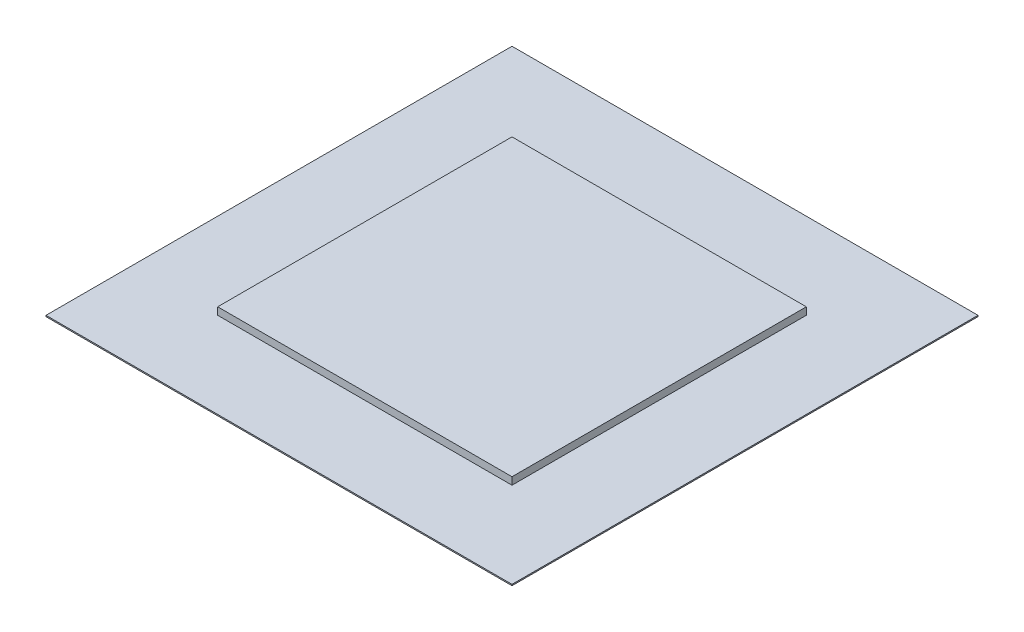
ISO-10303-21;
HEADER;
FILE_DESCRIPTION(('STEP AP214'),'2;1');
FILE_NAME('part.step','',(''),(''),'','','');
FILE_SCHEMA(('AUTOMOTIVE_DESIGN { 1 0 10303 214 1 1 1 1 }'));
ENDSEC;
DATA;
#1=APPLICATION_CONTEXT('core data for automotive mechanical design processes');
#2=APPLICATION_PROTOCOL_DEFINITION('international standard','automotive_design',2000,#1);
#3=PRODUCT_CONTEXT('',#1,'mechanical');
#4=PRODUCT('Part','Part','',(#3));
#5=PRODUCT_RELATED_PRODUCT_CATEGORY('part','',(#4));
#6=PRODUCT_DEFINITION_FORMATION('','',#4);
#7=PRODUCT_DEFINITION_CONTEXT('part definition',#1,'design');
#8=PRODUCT_DEFINITION('design','',#6,#7);
#9=PRODUCT_DEFINITION_SHAPE('','',#8);
#10=(LENGTH_UNIT() NAMED_UNIT(*) SI_UNIT(.MILLI.,.METRE.));
#11=(NAMED_UNIT(*) PLANE_ANGLE_UNIT() SI_UNIT($,.RADIAN.));
#12=(NAMED_UNIT(*) SI_UNIT($,.STERADIAN.) SOLID_ANGLE_UNIT());
#13=UNCERTAINTY_MEASURE_WITH_UNIT(LENGTH_MEASURE(1.E-05),#10,'distance_accuracy_value','');
#14=(GEOMETRIC_REPRESENTATION_CONTEXT(3) GLOBAL_UNCERTAINTY_ASSIGNED_CONTEXT((#13)) GLOBAL_UNIT_ASSIGNED_CONTEXT((#10,
#11,#12)) REPRESENTATION_CONTEXT('',''));
#15=CARTESIAN_POINT('',(0.,0.,0.));
#16=DIRECTION('',(0.,0.,1.));
#17=DIRECTION('',(1.,0.,0.));
#18=AXIS2_PLACEMENT_3D('',#15,#16,#17);
#19=CARTESIAN_POINT('',(1200.,60.,-1200.));
#20=DIRECTION('',(-1.,0.,0.));
#21=DIRECTION('',(0.,0.,1.));
#22=AXIS2_PLACEMENT_3D('',#19,#20,#21);
#23=PLANE('',#22);
#24=DIRECTION('',(0.,0.,-1.));
#25=VECTOR('',#24,1.);
#26=CARTESIAN_POINT('',(1200.,0.,-1200.));
#27=LINE('',#26,#25);
#28=CARTESIAN_POINT('',(1200.,0.,1200.));
#29=VERTEX_POINT('',#28);
#30=CARTESIAN_POINT('',(1200.,0.,-1200.));
#31=VERTEX_POINT('',#30);
#32=EDGE_CURVE('E120',#29,#31,#27,.T.);
#33=ORIENTED_EDGE('',*,*,#32,.T.);
#34=DIRECTION('',(0.,-1.,0.));
#35=VECTOR('',#34,1.);
#36=CARTESIAN_POINT('',(1200.,60.,-1200.));
#37=LINE('',#36,#35);
#38=CARTESIAN_POINT('',(1200.,60.,-1200.));
#39=VERTEX_POINT('',#38);
#40=EDGE_CURVE('E11',#39,#31,#37,.T.);
#41=ORIENTED_EDGE('',*,*,#40,.F.);
#42=DIRECTION('',(0.,0.,-1.));
#43=VECTOR('',#42,1.);
#44=CARTESIAN_POINT('',(1200.,60.,-1200.));
#45=LINE('',#44,#43);
#46=CARTESIAN_POINT('',(1200.,60.,1200.));
#47=VERTEX_POINT('',#46);
#48=EDGE_CURVE('E129',#47,#39,#45,.T.);
#49=ORIENTED_EDGE('',*,*,#48,.F.);
#50=DIRECTION('',(0.,-1.,0.));
#51=VECTOR('',#50,1.);
#52=CARTESIAN_POINT('',(1200.,60.,1200.));
#53=LINE('',#52,#51);
#54=EDGE_CURVE('E136',#47,#29,#53,.T.);
#55=ORIENTED_EDGE('',*,*,#54,.T.);
#56=EDGE_LOOP('',(#33,#41,#49,#55));
#57=FACE_BOUND('',#56,.T.);
#58=ADVANCED_FACE('F35',(#57),#23,.F.);
#59=CARTESIAN_POINT('',(-1200.,60.,-1200.));
#60=DIRECTION('',(0.,0.,1.));
#61=DIRECTION('',(1.,0.,0.));
#62=AXIS2_PLACEMENT_3D('',#59,#60,#61);
#63=PLANE('',#62);
#64=DIRECTION('',(-1.,0.,0.));
#65=VECTOR('',#64,1.);
#66=CARTESIAN_POINT('',(-1200.,0.,-1200.));
#67=LINE('',#66,#65);
#68=CARTESIAN_POINT('',(-1200.,0.,-1200.));
#69=VERTEX_POINT('',#68);
#70=EDGE_CURVE('E123',#31,#69,#67,.T.);
#71=ORIENTED_EDGE('',*,*,#70,.T.);
#72=DIRECTION('',(0.,-1.,0.));
#73=VECTOR('',#72,1.);
#74=CARTESIAN_POINT('',(-1200.,60.,-1200.));
#75=LINE('',#74,#73);
#76=CARTESIAN_POINT('',(-1200.,60.,-1200.));
#77=VERTEX_POINT('',#76);
#78=EDGE_CURVE('E43',#77,#69,#75,.T.);
#79=ORIENTED_EDGE('',*,*,#78,.F.);
#80=DIRECTION('',(-1.,0.,0.));
#81=VECTOR('',#80,1.);
#82=CARTESIAN_POINT('',(-1200.,60.,-1200.));
#83=LINE('',#82,#81);
#84=EDGE_CURVE('E131',#39,#77,#83,.T.);
#85=ORIENTED_EDGE('',*,*,#84,.F.);
#86=ORIENTED_EDGE('',*,*,#40,.T.);
#87=EDGE_LOOP('',(#71,#79,#85,#86));
#88=FACE_BOUND('',#87,.T.);
#89=ADVANCED_FACE('F157',(#88),#63,.F.);
#90=CARTESIAN_POINT('',(-1200.,60.,-1200.));
#91=DIRECTION('',(1.,0.,0.));
#92=DIRECTION('',(0.,0.,-1.));
#93=AXIS2_PLACEMENT_3D('',#90,#91,#92);
#94=PLANE('',#93);
#95=DIRECTION('',(0.,0.,1.));
#96=VECTOR('',#95,1.);
#97=CARTESIAN_POINT('',(-1200.,0.,-1200.));
#98=LINE('',#97,#96);
#99=CARTESIAN_POINT('',(-1200.,0.,1200.));
#100=VERTEX_POINT('',#99);
#101=EDGE_CURVE('E140',#69,#100,#98,.T.);
#102=ORIENTED_EDGE('',*,*,#101,.T.);
#103=DIRECTION('',(0.,-1.,0.));
#104=VECTOR('',#103,1.);
#105=CARTESIAN_POINT('',(-1200.,60.,1200.));
#106=LINE('',#105,#104);
#107=CARTESIAN_POINT('',(-1200.,60.,1200.));
#108=VERTEX_POINT('',#107);
#109=EDGE_CURVE('E147',#108,#100,#106,.T.);
#110=ORIENTED_EDGE('',*,*,#109,.F.);
#111=DIRECTION('',(0.,0.,1.));
#112=VECTOR('',#111,1.);
#113=CARTESIAN_POINT('',(-1200.,60.,-1200.));
#114=LINE('',#113,#112);
#115=EDGE_CURVE('E134',#77,#108,#114,.T.);
#116=ORIENTED_EDGE('',*,*,#115,.F.);
#117=ORIENTED_EDGE('',*,*,#78,.T.);
#118=EDGE_LOOP('',(#102,#110,#116,#117));
#119=FACE_BOUND('',#118,.T.);
#120=ADVANCED_FACE('F153',(#119),#94,.F.);
#121=CARTESIAN_POINT('',(-1200.,60.,1200.));
#122=DIRECTION('',(0.,0.,-1.));
#123=DIRECTION('',(-1.,0.,0.));
#124=AXIS2_PLACEMENT_3D('',#121,#122,#123);
#125=PLANE('',#124);
#126=DIRECTION('',(1.,0.,0.));
#127=VECTOR('',#126,1.);
#128=CARTESIAN_POINT('',(-1200.,0.,1200.));
#129=LINE('',#128,#127);
#130=EDGE_CURVE('E132',#100,#29,#129,.T.);
#131=ORIENTED_EDGE('',*,*,#130,.T.);
#132=ORIENTED_EDGE('',*,*,#54,.F.);
#133=DIRECTION('',(1.,0.,0.));
#134=VECTOR('',#133,1.);
#135=CARTESIAN_POINT('',(-1200.,60.,1200.));
#136=LINE('',#135,#134);
#137=EDGE_CURVE('E50',#108,#47,#136,.T.);
#138=ORIENTED_EDGE('',*,*,#137,.F.);
#139=ORIENTED_EDGE('',*,*,#109,.T.);
#140=EDGE_LOOP('',(#131,#132,#138,#139));
#141=FACE_BOUND('',#140,.T.);
#142=ADVANCED_FACE('F163',(#141),#125,.F.);
#143=CARTESIAN_POINT('',(0.,60.,0.));
#144=DIRECTION('',(0.,1.,0.));
#145=DIRECTION('',(0.,0.,1.));
#146=AXIS2_PLACEMENT_3D('',#143,#144,#145);
#147=PLANE('',#146);
#148=ORIENTED_EDGE('',*,*,#48,.T.);
#149=ORIENTED_EDGE('',*,*,#84,.T.);
#150=ORIENTED_EDGE('',*,*,#115,.T.);
#151=ORIENTED_EDGE('',*,*,#137,.T.);
#152=EDGE_LOOP('',(#148,#149,#150,#151));
#153=FACE_BOUND('',#152,.T.);
#154=ADVANCED_FACE('F166',(#153),#147,.T.);
#155=CARTESIAN_POINT('',(-1900.,-10.,-1900.));
#156=DIRECTION('',(0.,0.,1.));
#157=DIRECTION('',(1.,0.,0.));
#158=AXIS2_PLACEMENT_3D('',#155,#156,#157);
#159=PLANE('',#158);
#160=DIRECTION('',(1.,0.,0.));
#161=VECTOR('',#160,1.);
#162=CARTESIAN_POINT('',(-1900.,0.,-1900.));
#163=LINE('',#162,#161);
#164=CARTESIAN_POINT('',(-1900.,0.,-1900.));
#165=VERTEX_POINT('',#164);
#166=CARTESIAN_POINT('',(1900.,0.,-1900.));
#167=VERTEX_POINT('',#166);
#168=EDGE_CURVE('E119',#165,#167,#163,.T.);
#169=ORIENTED_EDGE('',*,*,#168,.T.);
#170=DIRECTION('',(0.,1.,0.));
#171=VECTOR('',#170,1.);
#172=CARTESIAN_POINT('',(1900.,-10.,-1900.));
#173=LINE('',#172,#171);
#174=CARTESIAN_POINT('',(1900.,-10.,-1900.));
#175=VERTEX_POINT('',#174);
#176=EDGE_CURVE('E99',#175,#167,#173,.T.);
#177=ORIENTED_EDGE('',*,*,#176,.F.);
#178=DIRECTION('',(1.,0.,0.));
#179=VECTOR('',#178,1.);
#180=CARTESIAN_POINT('',(-1900.,-10.,-1900.));
#181=LINE('',#180,#179);
#182=CARTESIAN_POINT('',(-1900.,-10.,-1900.));
#183=VERTEX_POINT('',#182);
#184=EDGE_CURVE('E106',#183,#175,#181,.T.);
#185=ORIENTED_EDGE('',*,*,#184,.F.);
#186=DIRECTION('',(0.,1.,0.));
#187=VECTOR('',#186,1.);
#188=CARTESIAN_POINT('',(-1900.,-10.,-1900.));
#189=LINE('',#188,#187);
#190=EDGE_CURVE('E246',#183,#165,#189,.T.);
#191=ORIENTED_EDGE('',*,*,#190,.T.);
#192=EDGE_LOOP('',(#169,#177,#185,#191));
#193=FACE_BOUND('',#192,.T.);
#194=ADVANCED_FACE('F117',(#193),#159,.F.);
#195=CARTESIAN_POINT('',(1900.,-10.,-1900.));
#196=DIRECTION('',(-1.,0.,0.));
#197=DIRECTION('',(0.,0.,1.));
#198=AXIS2_PLACEMENT_3D('',#195,#196,#197);
#199=PLANE('',#198);
#200=DIRECTION('',(0.,0.,1.));
#201=VECTOR('',#200,1.);
#202=CARTESIAN_POINT('',(1900.,0.,-1900.));
#203=LINE('',#202,#201);
#204=CARTESIAN_POINT('',(1900.,0.,1900.));
#205=VERTEX_POINT('',#204);
#206=EDGE_CURVE('E252',#167,#205,#203,.T.);
#207=ORIENTED_EDGE('',*,*,#206,.T.);
#208=DIRECTION('',(0.,1.,0.));
#209=VECTOR('',#208,1.);
#210=CARTESIAN_POINT('',(1900.,-10.,1900.));
#211=LINE('',#210,#209);
#212=CARTESIAN_POINT('',(1900.,-10.,1900.));
#213=VERTEX_POINT('',#212);
#214=EDGE_CURVE('E102',#213,#205,#211,.T.);
#215=ORIENTED_EDGE('',*,*,#214,.F.);
#216=DIRECTION('',(0.,0.,1.));
#217=VECTOR('',#216,1.);
#218=CARTESIAN_POINT('',(1900.,-10.,-1900.));
#219=LINE('',#218,#217);
#220=EDGE_CURVE('E95',#175,#213,#219,.T.);
#221=ORIENTED_EDGE('',*,*,#220,.F.);
#222=ORIENTED_EDGE('',*,*,#176,.T.);
#223=EDGE_LOOP('',(#207,#215,#221,#222));
#224=FACE_BOUND('',#223,.T.);
#225=ADVANCED_FACE('F97',(#224),#199,.F.);
#226=CARTESIAN_POINT('',(1900.,-10.,1900.));
#227=DIRECTION('',(0.,0.,-1.));
#228=DIRECTION('',(-1.,0.,0.));
#229=AXIS2_PLACEMENT_3D('',#226,#227,#228);
#230=PLANE('',#229);
#231=DIRECTION('',(-1.,0.,0.));
#232=VECTOR('',#231,1.);
#233=CARTESIAN_POINT('',(1900.,0.,1900.));
#234=LINE('',#233,#232);
#235=CARTESIAN_POINT('',(-1900.,0.,1900.));
#236=VERTEX_POINT('',#235);
#237=EDGE_CURVE('E249',#205,#236,#234,.T.);
#238=ORIENTED_EDGE('',*,*,#237,.T.);
#239=DIRECTION('',(0.,1.,0.));
#240=VECTOR('',#239,1.);
#241=CARTESIAN_POINT('',(-1900.,-10.,1900.));
#242=LINE('',#241,#240);
#243=CARTESIAN_POINT('',(-1900.,-10.,1900.));
#244=VERTEX_POINT('',#243);
#245=EDGE_CURVE('E125',#244,#236,#242,.T.);
#246=ORIENTED_EDGE('',*,*,#245,.F.);
#247=DIRECTION('',(-1.,0.,0.));
#248=VECTOR('',#247,1.);
#249=CARTESIAN_POINT('',(1900.,-10.,1900.));
#250=LINE('',#249,#248);
#251=EDGE_CURVE('E105',#213,#244,#250,.T.);
#252=ORIENTED_EDGE('',*,*,#251,.F.);
#253=ORIENTED_EDGE('',*,*,#214,.T.);
#254=EDGE_LOOP('',(#238,#246,#252,#253));
#255=FACE_BOUND('',#254,.T.);
#256=ADVANCED_FACE('F205',(#255),#230,.F.);
#257=CARTESIAN_POINT('',(-1900.,-10.,1900.));
#258=DIRECTION('',(1.,0.,0.));
#259=DIRECTION('',(0.,0.,-1.));
#260=AXIS2_PLACEMENT_3D('',#257,#258,#259);
#261=PLANE('',#260);
#262=DIRECTION('',(0.,0.,-1.));
#263=VECTOR('',#262,1.);
#264=CARTESIAN_POINT('',(-1900.,0.,1900.));
#265=LINE('',#264,#263);
#266=EDGE_CURVE('E115',#236,#165,#265,.T.);
#267=ORIENTED_EDGE('',*,*,#266,.T.);
#268=ORIENTED_EDGE('',*,*,#190,.F.);
#269=DIRECTION('',(0.,0.,-1.));
#270=VECTOR('',#269,1.);
#271=CARTESIAN_POINT('',(-1900.,-10.,1900.));
#272=LINE('',#271,#270);
#273=EDGE_CURVE('E111',#244,#183,#272,.T.);
#274=ORIENTED_EDGE('',*,*,#273,.F.);
#275=ORIENTED_EDGE('',*,*,#245,.T.);
#276=EDGE_LOOP('',(#267,#268,#274,#275));
#277=FACE_BOUND('',#276,.T.);
#278=ADVANCED_FACE('F214',(#277),#261,.F.);
#279=CARTESIAN_POINT('',(0.,-10.,0.));
#280=DIRECTION('',(0.,-1.,0.));
#281=DIRECTION('',(0.,0.,-1.));
#282=AXIS2_PLACEMENT_3D('',#279,#280,#281);
#283=PLANE('',#282);
#284=ORIENTED_EDGE('',*,*,#184,.T.);
#285=ORIENTED_EDGE('',*,*,#220,.T.);
#286=ORIENTED_EDGE('',*,*,#251,.T.);
#287=ORIENTED_EDGE('',*,*,#273,.T.);
#288=EDGE_LOOP('',(#284,#285,#286,#287));
#289=FACE_BOUND('',#288,.T.);
#290=ADVANCED_FACE('F109',(#289),#283,.T.);
#291=CARTESIAN_POINT('',(0.,0.,0.));
#292=DIRECTION('',(0.,-1.,0.));
#293=DIRECTION('',(0.,0.,-1.));
#294=AXIS2_PLACEMENT_3D('',#291,#292,#293);
#295=PLANE('',#294);
#296=ORIENTED_EDGE('',*,*,#32,.F.);
#297=ORIENTED_EDGE('',*,*,#130,.F.);
#298=ORIENTED_EDGE('',*,*,#101,.F.);
#299=ORIENTED_EDGE('',*,*,#70,.F.);
#300=EDGE_LOOP('',(#296,#297,#298,#299));
#301=FACE_BOUND('',#300,.T.);
#302=ORIENTED_EDGE('',*,*,#168,.F.);
#303=ORIENTED_EDGE('',*,*,#266,.F.);
#304=ORIENTED_EDGE('',*,*,#237,.F.);
#305=ORIENTED_EDGE('',*,*,#206,.F.);
#306=EDGE_LOOP('',(#302,#303,#304,#305));
#307=FACE_BOUND('',#306,.T.);
#308=ADVANCED_FACE('F160',(#301,#307),#295,.F.);
#309=CLOSED_SHELL('',(#58,#89,#120,#142,#154,#194,#225,#256,#278,#290,#308));
#310=MANIFOLD_SOLID_BREP('B2',#309);
#311=ADVANCED_BREP_SHAPE_REPRESENTATION('',(#18,#310),#14);
#312=SHAPE_DEFINITION_REPRESENTATION(#9,#311);
ENDSEC;
END-ISO-10303-21;
